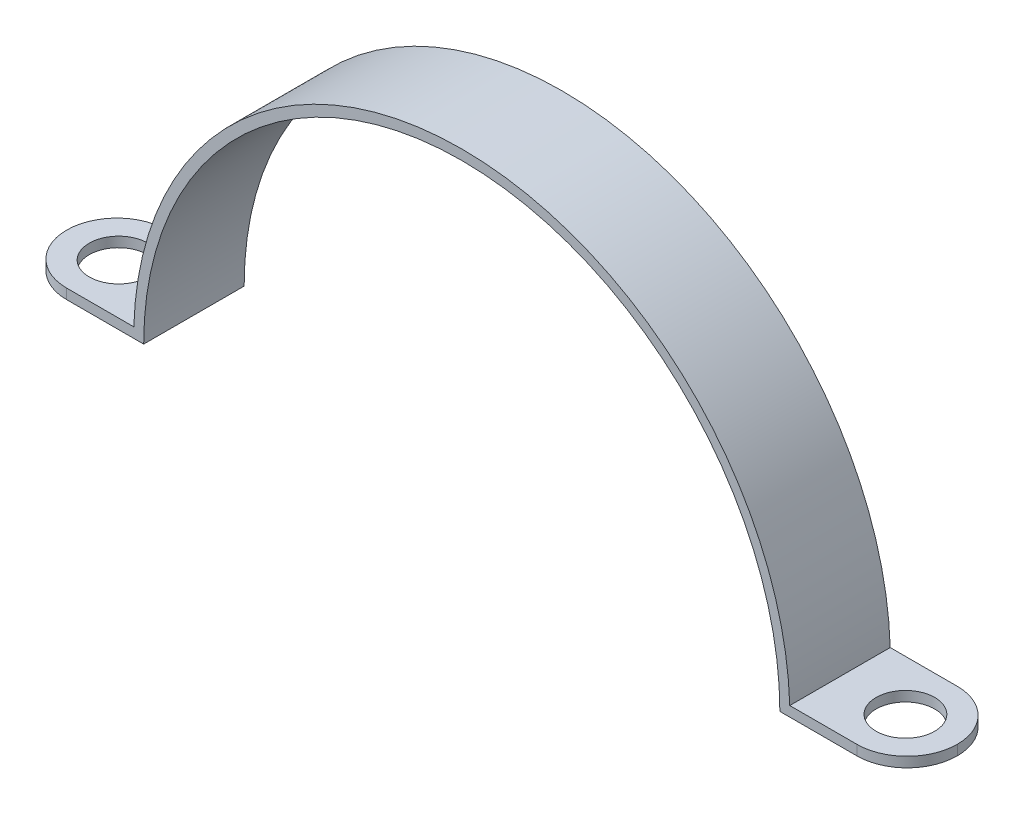
ISO-10303-21;
HEADER;
FILE_DESCRIPTION(('STEP AP214'),'2;1');
FILE_NAME('part.step','',(''),(''),'','','');
FILE_SCHEMA(('AUTOMOTIVE_DESIGN { 1 0 10303 214 1 1 1 1 }'));
ENDSEC;
DATA;
#1=APPLICATION_CONTEXT('core data for automotive mechanical design processes');
#2=APPLICATION_PROTOCOL_DEFINITION('international standard','automotive_design',2000,#1);
#3=PRODUCT_CONTEXT('',#1,'mechanical');
#4=PRODUCT('Part','Part','',(#3));
#5=PRODUCT_RELATED_PRODUCT_CATEGORY('part','',(#4));
#6=PRODUCT_DEFINITION_FORMATION('','',#4);
#7=PRODUCT_DEFINITION_CONTEXT('part definition',#1,'design');
#8=PRODUCT_DEFINITION('design','',#6,#7);
#9=PRODUCT_DEFINITION_SHAPE('','',#8);
#10=(LENGTH_UNIT() NAMED_UNIT(*) SI_UNIT(.MILLI.,.METRE.));
#11=(NAMED_UNIT(*) PLANE_ANGLE_UNIT() SI_UNIT($,.RADIAN.));
#12=(NAMED_UNIT(*) SI_UNIT($,.STERADIAN.) SOLID_ANGLE_UNIT());
#13=UNCERTAINTY_MEASURE_WITH_UNIT(LENGTH_MEASURE(1.E-05),#10,'distance_accuracy_value','');
#14=(GEOMETRIC_REPRESENTATION_CONTEXT(3) GLOBAL_UNCERTAINTY_ASSIGNED_CONTEXT((#13)) GLOBAL_UNIT_ASSIGNED_CONTEXT((#10,
#11,#12)) REPRESENTATION_CONTEXT('',''));
#15=CARTESIAN_POINT('',(0.,0.,0.));
#16=DIRECTION('',(0.,0.,1.));
#17=DIRECTION('',(1.,0.,0.));
#18=AXIS2_PLACEMENT_3D('',#15,#16,#17);
#19=CARTESIAN_POINT('',(19.,0.,3.));
#20=DIRECTION('',(0.,1.,0.));
#21=DIRECTION('',(0.,0.,1.));
#22=AXIS2_PLACEMENT_3D('',#19,#20,#21);
#23=PLANE('',#22);
#24=CARTESIAN_POINT('',(23.5,0.,0.));
#25=DIRECTION('',(0.,1.,0.));
#26=DIRECTION('',(-1.,0.,0.));
#27=AXIS2_PLACEMENT_3D('',#24,#25,#26);
#28=CIRCLE('',#27,1.75);
#29=CARTESIAN_POINT('',(21.75,0.,0.));
#30=VERTEX_POINT('',#29);
#31=EDGE_CURVE('E198',#30,#30,#28,.T.);
#32=ORIENTED_EDGE('',*,*,#31,.T.);
#33=EDGE_LOOP('',(#32));
#34=FACE_BOUND('',#33,.T.);
#35=DIRECTION('',(1.,0.,0.));
#36=VECTOR('',#35,1.);
#37=CARTESIAN_POINT('',(19.,0.,-3.));
#38=LINE('',#37,#36);
#39=CARTESIAN_POINT('',(19.,0.,-3.));
#40=VERTEX_POINT('',#39);
#41=CARTESIAN_POINT('',(23.6,0.,-3.));
#42=VERTEX_POINT('',#41);
#43=EDGE_CURVE('E146',#40,#42,#38,.T.);
#44=ORIENTED_EDGE('',*,*,#43,.T.);
#45=CARTESIAN_POINT('',(23.6,0.,0.));
#46=DIRECTION('',(0.,1.,0.));
#47=DIRECTION('',(0.,0.,1.));
#48=AXIS2_PLACEMENT_3D('',#45,#46,#47);
#49=CIRCLE('',#48,3.);
#50=CARTESIAN_POINT('',(26.6,0.,0.));
#51=VERTEX_POINT('',#50);
#52=EDGE_CURVE('E176',#42,#51,#49,.F.);
#53=ORIENTED_EDGE('',*,*,#52,.T.);
#54=CARTESIAN_POINT('',(23.6,0.,0.));
#55=DIRECTION('',(0.,1.,0.));
#56=DIRECTION('',(0.,0.,1.));
#57=AXIS2_PLACEMENT_3D('',#54,#55,#56);
#58=CIRCLE('',#57,3.);
#59=CARTESIAN_POINT('',(23.6,0.,3.));
#60=VERTEX_POINT('',#59);
#61=EDGE_CURVE('E174',#51,#60,#58,.F.);
#62=ORIENTED_EDGE('',*,*,#61,.T.);
#63=DIRECTION('',(1.,0.,0.));
#64=VECTOR('',#63,1.);
#65=CARTESIAN_POINT('',(19.,0.,3.));
#66=LINE('',#65,#64);
#67=CARTESIAN_POINT('',(19.,0.,3.));
#68=VERTEX_POINT('',#67);
#69=EDGE_CURVE('E121',#68,#60,#66,.T.);
#70=ORIENTED_EDGE('',*,*,#69,.F.);
#71=DIRECTION('',(0.,0.,-1.));
#72=VECTOR('',#71,1.);
#73=CARTESIAN_POINT('',(19.,0.,3.));
#74=LINE('',#73,#72);
#75=EDGE_CURVE('E145',#68,#40,#74,.T.);
#76=ORIENTED_EDGE('',*,*,#75,.T.);
#77=EDGE_LOOP('',(#44,#53,#62,#70,#76));
#78=FACE_BOUND('',#77,.T.);
#79=ADVANCED_FACE('F32',(#34,#78),#23,.F.);
#80=CARTESIAN_POINT('',(19.5908141739949,0.6,3.));
#81=DIRECTION('',(0.,-1.,0.));
#82=DIRECTION('',(1.,0.,0.));
#83=AXIS2_PLACEMENT_3D('',#80,#81,#82);
#84=PLANE('',#83);
#85=CARTESIAN_POINT('',(23.5,0.600000000000001,0.));
#86=DIRECTION('',(0.,1.,0.));
#87=DIRECTION('',(-1.,0.,0.));
#88=AXIS2_PLACEMENT_3D('',#85,#86,#87);
#89=CIRCLE('',#88,1.75);
#90=CARTESIAN_POINT('',(21.75,0.600000000000001,0.));
#91=VERTEX_POINT('',#90);
#92=EDGE_CURVE('E201',#91,#91,#89,.T.);
#93=ORIENTED_EDGE('',*,*,#92,.F.);
#94=EDGE_LOOP('',(#93));
#95=FACE_BOUND('',#94,.T.);
#96=CARTESIAN_POINT('',(23.6,0.6,0.));
#97=DIRECTION('',(0.,-1.,0.));
#98=DIRECTION('',(1.,0.,0.));
#99=AXIS2_PLACEMENT_3D('',#96,#97,#98);
#100=CIRCLE('',#99,3.);
#101=CARTESIAN_POINT('',(23.6,0.6,3.));
#102=VERTEX_POINT('',#101);
#103=CARTESIAN_POINT('',(26.6,0.6,0.));
#104=VERTEX_POINT('',#103);
#105=EDGE_CURVE('E130',#102,#104,#100,.F.);
#106=ORIENTED_EDGE('',*,*,#105,.T.);
#107=CARTESIAN_POINT('',(23.6,0.6,0.));
#108=DIRECTION('',(0.,-1.,0.));
#109=DIRECTION('',(1.,0.,0.));
#110=AXIS2_PLACEMENT_3D('',#107,#108,#109);
#111=CIRCLE('',#110,3.);
#112=CARTESIAN_POINT('',(23.6,0.6,-3.));
#113=VERTEX_POINT('',#112);
#114=EDGE_CURVE('E166',#104,#113,#111,.F.);
#115=ORIENTED_EDGE('',*,*,#114,.T.);
#116=DIRECTION('',(-1.,0.,0.));
#117=VECTOR('',#116,1.);
#118=CARTESIAN_POINT('',(19.5908141739949,0.6,-3.));
#119=LINE('',#118,#117);
#120=CARTESIAN_POINT('',(19.5908141739949,0.6,-3.));
#121=VERTEX_POINT('',#120);
#122=EDGE_CURVE('E127',#113,#121,#119,.T.);
#123=ORIENTED_EDGE('',*,*,#122,.T.);
#124=DIRECTION('',(0.,0.,-1.));
#125=VECTOR('',#124,1.);
#126=CARTESIAN_POINT('',(19.5908141739949,0.6,3.));
#127=LINE('',#126,#125);
#128=CARTESIAN_POINT('',(19.5908141739949,0.6,3.));
#129=VERTEX_POINT('',#128);
#130=EDGE_CURVE('E124',#129,#121,#127,.T.);
#131=ORIENTED_EDGE('',*,*,#130,.F.);
#132=DIRECTION('',(-1.,0.,0.));
#133=VECTOR('',#132,1.);
#134=CARTESIAN_POINT('',(19.5908141739949,0.6,3.));
#135=LINE('',#134,#133);
#136=EDGE_CURVE('E109',#102,#129,#135,.T.);
#137=ORIENTED_EDGE('',*,*,#136,.F.);
#138=EDGE_LOOP('',(#106,#115,#123,#131,#137));
#139=FACE_BOUND('',#138,.T.);
#140=ADVANCED_FACE('F125',(#95,#139),#84,.F.);
#141=CARTESIAN_POINT('',(0.,0.,3.));
#142=DIRECTION('',(0.,0.,-1.));
#143=DIRECTION('',(-1.,0.,0.));
#144=AXIS2_PLACEMENT_3D('',#141,#142,#143);
#145=CYLINDRICAL_SURFACE('',#144,19.6);
#146=CARTESIAN_POINT('',(0.,0.,-3.));
#147=DIRECTION('',(0.,0.,1.));
#148=DIRECTION('',(1.,0.,0.));
#149=AXIS2_PLACEMENT_3D('',#146,#147,#148);
#150=CIRCLE('',#149,19.6);
#151=CARTESIAN_POINT('',(-19.5908141739949,0.600000000000003,-3.));
#152=VERTEX_POINT('',#151);
#153=EDGE_CURVE('E151',#121,#152,#150,.T.);
#154=ORIENTED_EDGE('',*,*,#153,.T.);
#155=DIRECTION('',(0.,0.,-1.));
#156=VECTOR('',#155,1.);
#157=CARTESIAN_POINT('',(-19.5908141739949,0.600000000000003,3.));
#158=LINE('',#157,#156);
#159=CARTESIAN_POINT('',(-19.5908141739949,0.600000000000003,3.));
#160=VERTEX_POINT('',#159);
#161=EDGE_CURVE('E131',#160,#152,#158,.T.);
#162=ORIENTED_EDGE('',*,*,#161,.F.);
#163=CARTESIAN_POINT('',(0.,0.,3.));
#164=DIRECTION('',(0.,0.,1.));
#165=DIRECTION('',(1.,0.,0.));
#166=AXIS2_PLACEMENT_3D('',#163,#164,#165);
#167=CIRCLE('',#166,19.6);
#168=EDGE_CURVE('E115',#129,#160,#167,.T.);
#169=ORIENTED_EDGE('',*,*,#168,.F.);
#170=ORIENTED_EDGE('',*,*,#130,.T.);
#171=EDGE_LOOP('',(#154,#162,#169,#170));
#172=FACE_BOUND('',#171,.T.);
#173=ADVANCED_FACE('F133',(#172),#145,.T.);
#174=CARTESIAN_POINT('',(-26.6,0.6,3.));
#175=DIRECTION('',(0.,-1.,0.));
#176=DIRECTION('',(1.,0.,0.));
#177=AXIS2_PLACEMENT_3D('',#174,#175,#176);
#178=PLANE('',#177);
#179=CARTESIAN_POINT('',(-23.5,0.6,0.));
#180=DIRECTION('',(0.,1.,0.));
#181=DIRECTION('',(-1.,0.,0.));
#182=AXIS2_PLACEMENT_3D('',#179,#180,#181);
#183=CIRCLE('',#182,1.75);
#184=CARTESIAN_POINT('',(-25.25,0.6,0.));
#185=VERTEX_POINT('',#184);
#186=EDGE_CURVE('E193',#185,#185,#183,.T.);
#187=ORIENTED_EDGE('',*,*,#186,.F.);
#188=EDGE_LOOP('',(#187));
#189=FACE_BOUND('',#188,.T.);
#190=DIRECTION('',(-1.,0.,0.));
#191=VECTOR('',#190,1.);
#192=CARTESIAN_POINT('',(-26.6,0.6,-3.));
#193=LINE('',#192,#191);
#194=CARTESIAN_POINT('',(-23.6,0.6,-3.));
#195=VERTEX_POINT('',#194);
#196=EDGE_CURVE('E153',#152,#195,#193,.T.);
#197=ORIENTED_EDGE('',*,*,#196,.T.);
#198=CARTESIAN_POINT('',(-23.6,0.6,0.));
#199=DIRECTION('',(0.,-1.,0.));
#200=DIRECTION('',(1.,0.,0.));
#201=AXIS2_PLACEMENT_3D('',#198,#199,#200);
#202=CIRCLE('',#201,3.);
#203=CARTESIAN_POINT('',(-26.6,0.6,0.));
#204=VERTEX_POINT('',#203);
#205=EDGE_CURVE('E11',#195,#204,#202,.F.);
#206=ORIENTED_EDGE('',*,*,#205,.T.);
#207=CARTESIAN_POINT('',(-23.6,0.6,0.));
#208=DIRECTION('',(0.,-1.,0.));
#209=DIRECTION('',(1.,0.,0.));
#210=AXIS2_PLACEMENT_3D('',#207,#208,#209);
#211=CIRCLE('',#210,3.);
#212=CARTESIAN_POINT('',(-23.6,0.6,3.));
#213=VERTEX_POINT('',#212);
#214=EDGE_CURVE('E41',#204,#213,#211,.F.);
#215=ORIENTED_EDGE('',*,*,#214,.T.);
#216=DIRECTION('',(-1.,0.,0.));
#217=VECTOR('',#216,1.);
#218=CARTESIAN_POINT('',(-26.6,0.6,3.));
#219=LINE('',#218,#217);
#220=EDGE_CURVE('E136',#160,#213,#219,.T.);
#221=ORIENTED_EDGE('',*,*,#220,.F.);
#222=ORIENTED_EDGE('',*,*,#161,.T.);
#223=EDGE_LOOP('',(#197,#206,#215,#221,#222));
#224=FACE_BOUND('',#223,.T.);
#225=ADVANCED_FACE('F224',(#189,#224),#178,.F.);
#226=CARTESIAN_POINT('',(-26.6,0.,3.));
#227=DIRECTION('',(0.,1.,0.));
#228=DIRECTION('',(0.,0.,1.));
#229=AXIS2_PLACEMENT_3D('',#226,#227,#228);
#230=PLANE('',#229);
#231=CARTESIAN_POINT('',(-23.5,0.,0.));
#232=DIRECTION('',(0.,1.,0.));
#233=DIRECTION('',(-1.,0.,0.));
#234=AXIS2_PLACEMENT_3D('',#231,#232,#233);
#235=CIRCLE('',#234,1.75);
#236=CARTESIAN_POINT('',(-25.25,0.,0.));
#237=VERTEX_POINT('',#236);
#238=EDGE_CURVE('E189',#237,#237,#235,.T.);
#239=ORIENTED_EDGE('',*,*,#238,.T.);
#240=EDGE_LOOP('',(#239));
#241=FACE_BOUND('',#240,.T.);
#242=CARTESIAN_POINT('',(-23.6,0.,0.));
#243=DIRECTION('',(0.,1.,0.));
#244=DIRECTION('',(0.,0.,1.));
#245=AXIS2_PLACEMENT_3D('',#242,#243,#244);
#246=CIRCLE('',#245,3.);
#247=CARTESIAN_POINT('',(-23.6,0.,3.));
#248=VERTEX_POINT('',#247);
#249=CARTESIAN_POINT('',(-26.6,0.,0.));
#250=VERTEX_POINT('',#249);
#251=EDGE_CURVE('E55',#248,#250,#246,.F.);
#252=ORIENTED_EDGE('',*,*,#251,.T.);
#253=CARTESIAN_POINT('',(-23.6,0.,0.));
#254=DIRECTION('',(0.,1.,0.));
#255=DIRECTION('',(0.,0.,1.));
#256=AXIS2_PLACEMENT_3D('',#253,#254,#255);
#257=CIRCLE('',#256,3.);
#258=CARTESIAN_POINT('',(-23.6,0.,-3.));
#259=VERTEX_POINT('',#258);
#260=EDGE_CURVE('E182',#250,#259,#257,.F.);
#261=ORIENTED_EDGE('',*,*,#260,.T.);
#262=DIRECTION('',(1.,0.,0.));
#263=VECTOR('',#262,1.);
#264=CARTESIAN_POINT('',(-26.6,0.,-3.));
#265=LINE('',#264,#263);
#266=CARTESIAN_POINT('',(-19.,0.,-3.));
#267=VERTEX_POINT('',#266);
#268=EDGE_CURVE('E155',#259,#267,#265,.T.);
#269=ORIENTED_EDGE('',*,*,#268,.T.);
#270=DIRECTION('',(0.,0.,-1.));
#271=VECTOR('',#270,1.);
#272=CARTESIAN_POINT('',(-19.,0.,3.));
#273=LINE('',#272,#271);
#274=CARTESIAN_POINT('',(-19.,0.,3.));
#275=VERTEX_POINT('',#274);
#276=EDGE_CURVE('E161',#275,#267,#273,.T.);
#277=ORIENTED_EDGE('',*,*,#276,.F.);
#278=DIRECTION('',(1.,0.,0.));
#279=VECTOR('',#278,1.);
#280=CARTESIAN_POINT('',(-26.6,0.,3.));
#281=LINE('',#280,#279);
#282=EDGE_CURVE('E138',#248,#275,#281,.T.);
#283=ORIENTED_EDGE('',*,*,#282,.F.);
#284=EDGE_LOOP('',(#252,#261,#269,#277,#283));
#285=FACE_BOUND('',#284,.T.);
#286=ADVANCED_FACE('F222',(#241,#285),#230,.F.);
#287=CARTESIAN_POINT('',(0.,0.,3.));
#288=DIRECTION('',(0.,0.,-1.));
#289=DIRECTION('',(-1.,0.,0.));
#290=AXIS2_PLACEMENT_3D('',#287,#288,#289);
#291=CYLINDRICAL_SURFACE('',#290,19.);
#292=CARTESIAN_POINT('',(0.,0.,-3.));
#293=DIRECTION('',(0.,0.,-1.));
#294=DIRECTION('',(1.,0.,0.));
#295=AXIS2_PLACEMENT_3D('',#292,#293,#294);
#296=CIRCLE('',#295,19.);
#297=EDGE_CURVE('E157',#267,#40,#296,.T.);
#298=ORIENTED_EDGE('',*,*,#297,.T.);
#299=ORIENTED_EDGE('',*,*,#75,.F.);
#300=CARTESIAN_POINT('',(0.,0.,3.));
#301=DIRECTION('',(0.,0.,-1.));
#302=DIRECTION('',(1.,0.,0.));
#303=AXIS2_PLACEMENT_3D('',#300,#301,#302);
#304=CIRCLE('',#303,19.);
#305=EDGE_CURVE('E143',#275,#68,#304,.T.);
#306=ORIENTED_EDGE('',*,*,#305,.F.);
#307=ORIENTED_EDGE('',*,*,#276,.T.);
#308=EDGE_LOOP('',(#298,#299,#306,#307));
#309=FACE_BOUND('',#308,.T.);
#310=ADVANCED_FACE('F220',(#309),#291,.F.);
#311=CARTESIAN_POINT('',(0.,0.,3.));
#312=DIRECTION('',(0.,0.,1.));
#313=DIRECTION('',(1.,0.,0.));
#314=AXIS2_PLACEMENT_3D('',#311,#312,#313);
#315=PLANE('',#314);
#316=ORIENTED_EDGE('',*,*,#69,.T.);
#317=DIRECTION('',(0.,1.,0.));
#318=VECTOR('',#317,1.);
#319=CARTESIAN_POINT('',(23.6,0.6,3.));
#320=LINE('',#319,#318);
#321=EDGE_CURVE('E118',#60,#102,#320,.T.);
#322=ORIENTED_EDGE('',*,*,#321,.T.);
#323=ORIENTED_EDGE('',*,*,#136,.T.);
#324=ORIENTED_EDGE('',*,*,#168,.T.);
#325=ORIENTED_EDGE('',*,*,#220,.T.);
#326=DIRECTION('',(0.,-1.,0.));
#327=VECTOR('',#326,1.);
#328=CARTESIAN_POINT('',(-23.6,0.,3.));
#329=LINE('',#328,#327);
#330=EDGE_CURVE('E178',#213,#248,#329,.T.);
#331=ORIENTED_EDGE('',*,*,#330,.T.);
#332=ORIENTED_EDGE('',*,*,#282,.T.);
#333=ORIENTED_EDGE('',*,*,#305,.T.);
#334=EDGE_LOOP('',(#316,#322,#323,#324,#325,#331,#332,#333));
#335=FACE_BOUND('',#334,.T.);
#336=ADVANCED_FACE('F112',(#335),#315,.T.);
#337=CARTESIAN_POINT('',(0.,0.,-3.));
#338=DIRECTION('',(0.,0.,1.));
#339=DIRECTION('',(1.,0.,0.));
#340=AXIS2_PLACEMENT_3D('',#337,#338,#339);
#341=PLANE('',#340);
#342=ORIENTED_EDGE('',*,*,#122,.F.);
#343=DIRECTION('',(0.,1.,0.));
#344=VECTOR('',#343,1.);
#345=CARTESIAN_POINT('',(23.6,0.,-3.));
#346=LINE('',#345,#344);
#347=EDGE_CURVE('E171',#113,#42,#346,.F.);
#348=ORIENTED_EDGE('',*,*,#347,.T.);
#349=ORIENTED_EDGE('',*,*,#43,.F.);
#350=ORIENTED_EDGE('',*,*,#297,.F.);
#351=ORIENTED_EDGE('',*,*,#268,.F.);
#352=DIRECTION('',(0.,-1.,0.));
#353=VECTOR('',#352,1.);
#354=CARTESIAN_POINT('',(-23.6,0.,-3.));
#355=LINE('',#354,#353);
#356=EDGE_CURVE('E168',#259,#195,#355,.F.);
#357=ORIENTED_EDGE('',*,*,#356,.T.);
#358=ORIENTED_EDGE('',*,*,#196,.F.);
#359=ORIENTED_EDGE('',*,*,#153,.F.);
#360=EDGE_LOOP('',(#342,#348,#349,#350,#351,#357,#358,#359));
#361=FACE_BOUND('',#360,.T.);
#362=ADVANCED_FACE('F212',(#361),#341,.F.);
#363=CARTESIAN_POINT('',(23.6,0.,0.));
#364=DIRECTION('',(0.,-1.,0.));
#365=DIRECTION('',(0.,0.,-1.));
#366=AXIS2_PLACEMENT_3D('',#363,#364,#365);
#367=CYLINDRICAL_SURFACE('',#366,3.);
#368=ORIENTED_EDGE('',*,*,#321,.F.);
#369=ORIENTED_EDGE('',*,*,#61,.F.);
#370=DIRECTION('',(0.,1.,0.));
#371=VECTOR('',#370,1.);
#372=CARTESIAN_POINT('',(26.6,0.,0.));
#373=LINE('',#372,#371);
#374=EDGE_CURVE('E149',#104,#51,#373,.F.);
#375=ORIENTED_EDGE('',*,*,#374,.F.);
#376=ORIENTED_EDGE('',*,*,#105,.F.);
#377=EDGE_LOOP('',(#368,#369,#375,#376));
#378=FACE_BOUND('',#377,.T.);
#379=ADVANCED_FACE('F209',(#378),#367,.T.);
#380=CARTESIAN_POINT('',(23.6,0.6,0.));
#381=DIRECTION('',(0.,1.,0.));
#382=DIRECTION('',(0.,0.,1.));
#383=AXIS2_PLACEMENT_3D('',#380,#381,#382);
#384=CYLINDRICAL_SURFACE('',#383,3.);
#385=ORIENTED_EDGE('',*,*,#52,.F.);
#386=ORIENTED_EDGE('',*,*,#347,.F.);
#387=ORIENTED_EDGE('',*,*,#114,.F.);
#388=ORIENTED_EDGE('',*,*,#374,.T.);
#389=EDGE_LOOP('',(#385,#386,#387,#388));
#390=FACE_BOUND('',#389,.T.);
#391=ADVANCED_FACE('F215',(#390),#384,.T.);
#392=CARTESIAN_POINT('',(-23.6,0.,0.));
#393=DIRECTION('',(0.,1.,0.));
#394=DIRECTION('',(0.,0.,1.));
#395=AXIS2_PLACEMENT_3D('',#392,#393,#394);
#396=CYLINDRICAL_SURFACE('',#395,3.);
#397=ORIENTED_EDGE('',*,*,#330,.F.);
#398=ORIENTED_EDGE('',*,*,#214,.F.);
#399=DIRECTION('',(0.,-1.,0.));
#400=VECTOR('',#399,1.);
#401=CARTESIAN_POINT('',(-26.6,0.6,0.));
#402=LINE('',#401,#400);
#403=EDGE_CURVE('E36',#250,#204,#402,.F.);
#404=ORIENTED_EDGE('',*,*,#403,.F.);
#405=ORIENTED_EDGE('',*,*,#251,.F.);
#406=EDGE_LOOP('',(#397,#398,#404,#405));
#407=FACE_BOUND('',#406,.T.);
#408=ADVANCED_FACE('F34',(#407),#396,.T.);
#409=CARTESIAN_POINT('',(-23.6,0.6,0.));
#410=DIRECTION('',(0.,-1.,0.));
#411=DIRECTION('',(0.,0.,-1.));
#412=AXIS2_PLACEMENT_3D('',#409,#410,#411);
#413=CYLINDRICAL_SURFACE('',#412,3.);
#414=ORIENTED_EDGE('',*,*,#205,.F.);
#415=ORIENTED_EDGE('',*,*,#356,.F.);
#416=ORIENTED_EDGE('',*,*,#260,.F.);
#417=ORIENTED_EDGE('',*,*,#403,.T.);
#418=EDGE_LOOP('',(#414,#415,#416,#417));
#419=FACE_BOUND('',#418,.T.);
#420=ADVANCED_FACE('F223',(#419),#413,.T.);
#421=CARTESIAN_POINT('',(-23.5,0.,0.));
#422=DIRECTION('',(0.,1.,0.));
#423=DIRECTION('',(-1.,0.,0.));
#424=AXIS2_PLACEMENT_3D('',#421,#422,#423);
#425=CYLINDRICAL_SURFACE('',#424,1.75);
#426=ORIENTED_EDGE('',*,*,#238,.F.);
#427=EDGE_LOOP('',(#426));
#428=FACE_BOUND('',#427,.T.);
#429=ORIENTED_EDGE('',*,*,#186,.T.);
#430=EDGE_LOOP('',(#429));
#431=FACE_BOUND('',#430,.T.);
#432=ADVANCED_FACE('F232',(#428,#431),#425,.F.);
#433=CARTESIAN_POINT('',(23.5,0.,0.));
#434=DIRECTION('',(0.,1.,0.));
#435=DIRECTION('',(-1.,0.,0.));
#436=AXIS2_PLACEMENT_3D('',#433,#434,#435);
#437=CYLINDRICAL_SURFACE('',#436,1.75);
#438=ORIENTED_EDGE('',*,*,#31,.F.);
#439=EDGE_LOOP('',(#438));
#440=FACE_BOUND('',#439,.T.);
#441=ORIENTED_EDGE('',*,*,#92,.T.);
#442=EDGE_LOOP('',(#441));
#443=FACE_BOUND('',#442,.T.);
#444=ADVANCED_FACE('F332',(#440,#443),#437,.F.);
#445=CLOSED_SHELL('',(#79,#140,#173,#225,#286,#310,#336,#362,#379,#391,#408,#420,#432,#444));
#446=MANIFOLD_SOLID_BREP('B2',#445);
#447=ADVANCED_BREP_SHAPE_REPRESENTATION('',(#18,#446),#14);
#448=SHAPE_DEFINITION_REPRESENTATION(#9,#447);
ENDSEC;
END-ISO-10303-21;
